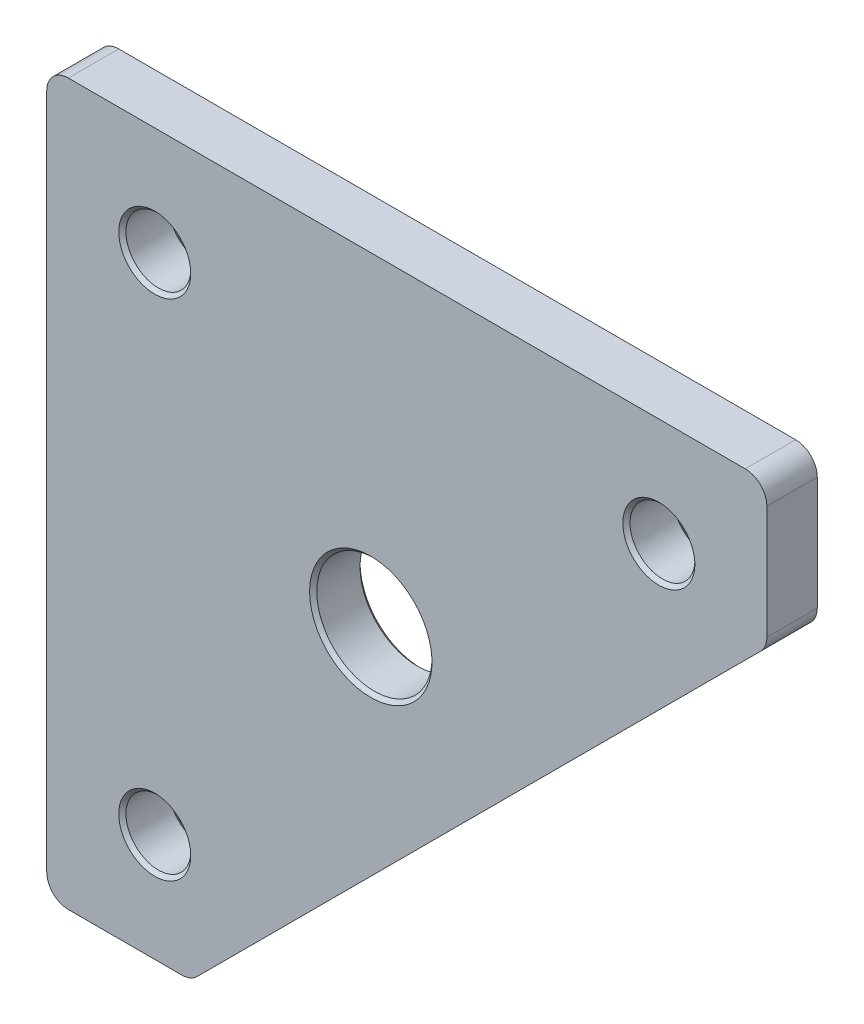
ISO-10303-21;
HEADER;
FILE_DESCRIPTION(('STEP AP214'),'2;1');
FILE_NAME('part.step','',(''),(''),'','','');
FILE_SCHEMA(('AUTOMOTIVE_DESIGN { 1 0 10303 214 1 1 1 1 }'));
ENDSEC;
DATA;
#1=APPLICATION_CONTEXT('core data for automotive mechanical design processes');
#2=APPLICATION_PROTOCOL_DEFINITION('international standard','automotive_design',2000,#1);
#3=PRODUCT_CONTEXT('',#1,'mechanical');
#4=PRODUCT('Part','Part','',(#3));
#5=PRODUCT_RELATED_PRODUCT_CATEGORY('part','',(#4));
#6=PRODUCT_DEFINITION_FORMATION('','',#4);
#7=PRODUCT_DEFINITION_CONTEXT('part definition',#1,'design');
#8=PRODUCT_DEFINITION('design','',#6,#7);
#9=PRODUCT_DEFINITION_SHAPE('','',#8);
#10=(LENGTH_UNIT() NAMED_UNIT(*) SI_UNIT(.MILLI.,.METRE.));
#11=(NAMED_UNIT(*) PLANE_ANGLE_UNIT() SI_UNIT($,.RADIAN.));
#12=(NAMED_UNIT(*) SI_UNIT($,.STERADIAN.) SOLID_ANGLE_UNIT());
#13=UNCERTAINTY_MEASURE_WITH_UNIT(LENGTH_MEASURE(1.E-05),#10,'distance_accuracy_value','');
#14=(GEOMETRIC_REPRESENTATION_CONTEXT(3) GLOBAL_UNCERTAINTY_ASSIGNED_CONTEXT((#13)) GLOBAL_UNIT_ASSIGNED_CONTEXT((#10,
#11,#12)) REPRESENTATION_CONTEXT('',''));
#15=CARTESIAN_POINT('',(0.,0.,0.));
#16=DIRECTION('',(0.,0.,1.));
#17=DIRECTION('',(1.,0.,0.));
#18=AXIS2_PLACEMENT_3D('',#15,#16,#17);
#19=CARTESIAN_POINT('',(0.,-100.,7.));
#20=DIRECTION('',(-1.,0.,0.));
#21=DIRECTION('',(0.,0.,1.));
#22=AXIS2_PLACEMENT_3D('',#19,#20,#21);
#23=PLANE('',#22);
#24=DIRECTION('',(0.,1.,0.));
#25=VECTOR('',#24,1.);
#26=CARTESIAN_POINT('',(0.,-100.,0.));
#27=LINE('',#26,#25);
#28=CARTESIAN_POINT('',(0.,-97.,0.));
#29=VERTEX_POINT('',#28);
#30=CARTESIAN_POINT('',(0.,-3.,0.));
#31=VERTEX_POINT('',#30);
#32=EDGE_CURVE('E194',#29,#31,#27,.T.);
#33=ORIENTED_EDGE('',*,*,#32,.F.);
#34=DIRECTION('',(0.,0.,-1.));
#35=VECTOR('',#34,1.);
#36=CARTESIAN_POINT('',(0.,-97.,7.));
#37=LINE('',#36,#35);
#38=CARTESIAN_POINT('',(0.,-97.,7.));
#39=VERTEX_POINT('',#38);
#40=EDGE_CURVE('E155',#29,#39,#37,.F.);
#41=ORIENTED_EDGE('',*,*,#40,.T.);
#42=DIRECTION('',(0.,1.,0.));
#43=VECTOR('',#42,1.);
#44=CARTESIAN_POINT('',(0.,-100.,7.));
#45=LINE('',#44,#43);
#46=CARTESIAN_POINT('',(0.,-3.,7.));
#47=VERTEX_POINT('',#46);
#48=EDGE_CURVE('E133',#39,#47,#45,.T.);
#49=ORIENTED_EDGE('',*,*,#48,.T.);
#50=DIRECTION('',(0.,0.,-1.));
#51=VECTOR('',#50,1.);
#52=CARTESIAN_POINT('',(0.,-3.,7.));
#53=LINE('',#52,#51);
#54=EDGE_CURVE('E152',#47,#31,#53,.T.);
#55=ORIENTED_EDGE('',*,*,#54,.T.);
#56=EDGE_LOOP('',(#33,#41,#49,#55));
#57=FACE_BOUND('',#56,.T.);
#58=ADVANCED_FACE('F33',(#57),#23,.T.);
#59=CARTESIAN_POINT('',(20.,-100.,7.));
#60=DIRECTION('',(0.,-1.,0.));
#61=DIRECTION('',(0.,0.,-1.));
#62=AXIS2_PLACEMENT_3D('',#59,#60,#61);
#63=PLANE('',#62);
#64=DIRECTION('',(-1.,0.,0.));
#65=VECTOR('',#64,1.);
#66=CARTESIAN_POINT('',(20.,-100.,7.));
#67=LINE('',#66,#65);
#68=CARTESIAN_POINT('',(18.7573593128807,-100.,7.));
#69=VERTEX_POINT('',#68);
#70=CARTESIAN_POINT('',(3.,-100.,7.));
#71=VERTEX_POINT('',#70);
#72=EDGE_CURVE('E205',#69,#71,#67,.T.);
#73=ORIENTED_EDGE('',*,*,#72,.T.);
#74=DIRECTION('',(0.,0.,-1.));
#75=VECTOR('',#74,1.);
#76=CARTESIAN_POINT('',(3.,-100.,7.));
#77=LINE('',#76,#75);
#78=CARTESIAN_POINT('',(3.,-100.,0.));
#79=VERTEX_POINT('',#78);
#80=EDGE_CURVE('E132',#71,#79,#77,.T.);
#81=ORIENTED_EDGE('',*,*,#80,.T.);
#82=DIRECTION('',(-1.,0.,0.));
#83=VECTOR('',#82,1.);
#84=CARTESIAN_POINT('',(20.,-100.,0.));
#85=LINE('',#84,#83);
#86=CARTESIAN_POINT('',(18.7573593128807,-100.,0.));
#87=VERTEX_POINT('',#86);
#88=EDGE_CURVE('E115',#87,#79,#85,.T.);
#89=ORIENTED_EDGE('',*,*,#88,.F.);
#90=DIRECTION('',(0.,0.,-1.));
#91=VECTOR('',#90,1.);
#92=CARTESIAN_POINT('',(18.7573593128807,-100.,7.));
#93=LINE('',#92,#91);
#94=EDGE_CURVE('E129',#87,#69,#93,.F.);
#95=ORIENTED_EDGE('',*,*,#94,.T.);
#96=EDGE_LOOP('',(#73,#81,#89,#95));
#97=FACE_BOUND('',#96,.T.);
#98=ADVANCED_FACE('F128',(#97),#63,.T.);
#99=CARTESIAN_POINT('',(100.,-20.,7.));
#100=DIRECTION('',(0.707106781186548,-0.707106781186548,0.));
#101=DIRECTION('',(0.707106781186547,0.707106781186548,0.));
#102=AXIS2_PLACEMENT_3D('',#99,#100,#101);
#103=PLANE('',#102);
#104=DIRECTION('',(-0.707106781186547,-0.707106781186548,0.));
#105=VECTOR('',#104,1.);
#106=CARTESIAN_POINT('',(100.,-20.,7.));
#107=LINE('',#106,#105);
#108=CARTESIAN_POINT('',(99.1213203435596,-20.8786796564403,7.));
#109=VERTEX_POINT('',#108);
#110=CARTESIAN_POINT('',(20.8786796564404,-99.1213203435596,7.));
#111=VERTEX_POINT('',#110);
#112=EDGE_CURVE('E186',#109,#111,#107,.T.);
#113=ORIENTED_EDGE('',*,*,#112,.T.);
#114=DIRECTION('',(0.,0.,-1.));
#115=VECTOR('',#114,1.);
#116=CARTESIAN_POINT('',(20.8786796564404,-99.1213203435596,7.));
#117=LINE('',#116,#115);
#118=CARTESIAN_POINT('',(20.8786796564404,-99.1213203435596,0.));
#119=VERTEX_POINT('',#118);
#120=EDGE_CURVE('E171',#111,#119,#117,.T.);
#121=ORIENTED_EDGE('',*,*,#120,.T.);
#122=DIRECTION('',(-0.707106781186547,-0.707106781186548,0.));
#123=VECTOR('',#122,1.);
#124=CARTESIAN_POINT('',(100.,-20.,0.));
#125=LINE('',#124,#123);
#126=CARTESIAN_POINT('',(99.1213203435596,-20.8786796564403,0.));
#127=VERTEX_POINT('',#126);
#128=EDGE_CURVE('E117',#127,#119,#125,.T.);
#129=ORIENTED_EDGE('',*,*,#128,.F.);
#130=DIRECTION('',(0.,0.,-1.));
#131=VECTOR('',#130,1.);
#132=CARTESIAN_POINT('',(99.1213203435596,-20.8786796564403,7.));
#133=LINE('',#132,#131);
#134=EDGE_CURVE('E169',#127,#109,#133,.F.);
#135=ORIENTED_EDGE('',*,*,#134,.T.);
#136=EDGE_LOOP('',(#113,#121,#129,#135));
#137=FACE_BOUND('',#136,.T.);
#138=ADVANCED_FACE('F271',(#137),#103,.T.);
#139=CARTESIAN_POINT('',(100.,0.,7.));
#140=DIRECTION('',(1.,0.,0.));
#141=DIRECTION('',(0.,0.,-1.));
#142=AXIS2_PLACEMENT_3D('',#139,#140,#141);
#143=PLANE('',#142);
#144=DIRECTION('',(0.,-1.,0.));
#145=VECTOR('',#144,1.);
#146=CARTESIAN_POINT('',(100.,0.,7.));
#147=LINE('',#146,#145);
#148=CARTESIAN_POINT('',(100.,-3.,7.));
#149=VERTEX_POINT('',#148);
#150=CARTESIAN_POINT('',(100.,-18.7573593128807,7.));
#151=VERTEX_POINT('',#150);
#152=EDGE_CURVE('E177',#149,#151,#147,.T.);
#153=ORIENTED_EDGE('',*,*,#152,.T.);
#154=DIRECTION('',(0.,0.,-1.));
#155=VECTOR('',#154,1.);
#156=CARTESIAN_POINT('',(100.,-18.7573593128807,7.));
#157=LINE('',#156,#155);
#158=CARTESIAN_POINT('',(100.,-18.7573593128807,0.));
#159=VERTEX_POINT('',#158);
#160=EDGE_CURVE('E11',#151,#159,#157,.T.);
#161=ORIENTED_EDGE('',*,*,#160,.T.);
#162=DIRECTION('',(0.,-1.,0.));
#163=VECTOR('',#162,1.);
#164=CARTESIAN_POINT('',(100.,0.,0.));
#165=LINE('',#164,#163);
#166=CARTESIAN_POINT('',(100.,-3.,0.));
#167=VERTEX_POINT('',#166);
#168=EDGE_CURVE('E180',#167,#159,#165,.T.);
#169=ORIENTED_EDGE('',*,*,#168,.F.);
#170=DIRECTION('',(0.,0.,-1.));
#171=VECTOR('',#170,1.);
#172=CARTESIAN_POINT('',(100.,-3.,7.));
#173=LINE('',#172,#171);
#174=EDGE_CURVE('E41',#167,#149,#173,.F.);
#175=ORIENTED_EDGE('',*,*,#174,.T.);
#176=EDGE_LOOP('',(#153,#161,#169,#175));
#177=FACE_BOUND('',#176,.T.);
#178=ADVANCED_FACE('F176',(#177),#143,.T.);
#179=CARTESIAN_POINT('',(0.,0.,7.));
#180=DIRECTION('',(0.,1.,0.));
#181=DIRECTION('',(0.,0.,1.));
#182=AXIS2_PLACEMENT_3D('',#179,#180,#181);
#183=PLANE('',#182);
#184=DIRECTION('',(1.,0.,0.));
#185=VECTOR('',#184,1.);
#186=CARTESIAN_POINT('',(0.,0.,0.));
#187=LINE('',#186,#185);
#188=CARTESIAN_POINT('',(3.,0.,0.));
#189=VERTEX_POINT('',#188);
#190=CARTESIAN_POINT('',(97.,0.,0.));
#191=VERTEX_POINT('',#190);
#192=EDGE_CURVE('E192',#189,#191,#187,.T.);
#193=ORIENTED_EDGE('',*,*,#192,.F.);
#194=DIRECTION('',(0.,0.,-1.));
#195=VECTOR('',#194,1.);
#196=CARTESIAN_POINT('',(3.,0.,7.));
#197=LINE('',#196,#195);
#198=CARTESIAN_POINT('',(3.,0.,7.));
#199=VERTEX_POINT('',#198);
#200=EDGE_CURVE('E55',#189,#199,#197,.F.);
#201=ORIENTED_EDGE('',*,*,#200,.T.);
#202=DIRECTION('',(1.,0.,0.));
#203=VECTOR('',#202,1.);
#204=CARTESIAN_POINT('',(0.,0.,7.));
#205=LINE('',#204,#203);
#206=CARTESIAN_POINT('',(97.,0.,7.));
#207=VERTEX_POINT('',#206);
#208=EDGE_CURVE('E187',#199,#207,#205,.T.);
#209=ORIENTED_EDGE('',*,*,#208,.T.);
#210=DIRECTION('',(0.,0.,-1.));
#211=VECTOR('',#210,1.);
#212=CARTESIAN_POINT('',(97.,0.,7.));
#213=LINE('',#212,#211);
#214=EDGE_CURVE('E165',#207,#191,#213,.T.);
#215=ORIENTED_EDGE('',*,*,#214,.T.);
#216=EDGE_LOOP('',(#193,#201,#209,#215));
#217=FACE_BOUND('',#216,.T.);
#218=ADVANCED_FACE('F191',(#217),#183,.T.);
#219=CARTESIAN_POINT('',(0.,0.,7.));
#220=DIRECTION('',(0.,0.,-1.));
#221=DIRECTION('',(-1.,0.,0.));
#222=AXIS2_PLACEMENT_3D('',#219,#220,#221);
#223=PLANE('',#222);
#224=CARTESIAN_POINT('',(15.,-85.,7.));
#225=DIRECTION('',(0.,0.,-1.));
#226=DIRECTION('',(-1.,0.,0.));
#227=AXIS2_PLACEMENT_3D('',#224,#225,#226);
#228=CIRCLE('',#227,5.00000000004485);
#229=CARTESIAN_POINT('',(9.99999999995517,-85.,7.));
#230=VERTEX_POINT('',#229);
#231=EDGE_CURVE('E229',#230,#230,#228,.T.);
#232=ORIENTED_EDGE('',*,*,#231,.T.);
#233=EDGE_LOOP('',(#232));
#234=FACE_BOUND('',#233,.T.);
#235=CARTESIAN_POINT('',(15.,-15.,7.));
#236=DIRECTION('',(0.,0.,-1.));
#237=DIRECTION('',(-1.,0.,0.));
#238=AXIS2_PLACEMENT_3D('',#235,#236,#237);
#239=CIRCLE('',#238,5.00000000004483);
#240=CARTESIAN_POINT('',(9.99999999995517,-15.,7.));
#241=VERTEX_POINT('',#240);
#242=EDGE_CURVE('E226',#241,#241,#239,.T.);
#243=ORIENTED_EDGE('',*,*,#242,.T.);
#244=EDGE_LOOP('',(#243));
#245=FACE_BOUND('',#244,.T.);
#246=CARTESIAN_POINT('',(45.,-45.,7.));
#247=DIRECTION('',(0.,0.,-1.));
#248=DIRECTION('',(-1.,0.,0.));
#249=AXIS2_PLACEMENT_3D('',#246,#247,#248);
#250=CIRCLE('',#249,8.50000000004486);
#251=CARTESIAN_POINT('',(36.4999999999551,-45.,7.));
#252=VERTEX_POINT('',#251);
#253=EDGE_CURVE('E223',#252,#252,#250,.T.);
#254=ORIENTED_EDGE('',*,*,#253,.T.);
#255=EDGE_LOOP('',(#254));
#256=FACE_BOUND('',#255,.T.);
#257=CARTESIAN_POINT('',(85.,-15.,7.));
#258=DIRECTION('',(0.,0.,-1.));
#259=DIRECTION('',(-1.,0.,0.));
#260=AXIS2_PLACEMENT_3D('',#257,#258,#259);
#261=CIRCLE('',#260,5.00000000004483);
#262=CARTESIAN_POINT('',(79.9999999999552,-15.,7.));
#263=VERTEX_POINT('',#262);
#264=EDGE_CURVE('E220',#263,#263,#261,.T.);
#265=ORIENTED_EDGE('',*,*,#264,.T.);
#266=EDGE_LOOP('',(#265));
#267=FACE_BOUND('',#266,.T.);
#268=ORIENTED_EDGE('',*,*,#48,.F.);
#269=CARTESIAN_POINT('',(3.,-97.,7.));
#270=DIRECTION('',(0.,0.,-1.));
#271=DIRECTION('',(-1.,0.,0.));
#272=AXIS2_PLACEMENT_3D('',#269,#270,#271);
#273=CIRCLE('',#272,3.);
#274=EDGE_CURVE('E163',#39,#71,#273,.F.);
#275=ORIENTED_EDGE('',*,*,#274,.T.);
#276=ORIENTED_EDGE('',*,*,#72,.F.);
#277=CARTESIAN_POINT('',(18.7573593128807,-97.,7.));
#278=DIRECTION('',(0.,0.,-1.));
#279=DIRECTION('',(-1.,0.,0.));
#280=AXIS2_PLACEMENT_3D('',#277,#278,#279);
#281=CIRCLE('',#280,3.);
#282=EDGE_CURVE('E137',#69,#111,#281,.F.);
#283=ORIENTED_EDGE('',*,*,#282,.T.);
#284=ORIENTED_EDGE('',*,*,#112,.F.);
#285=CARTESIAN_POINT('',(97.,-18.7573593128807,7.));
#286=DIRECTION('',(0.,0.,-1.));
#287=DIRECTION('',(-1.,0.,0.));
#288=AXIS2_PLACEMENT_3D('',#285,#286,#287);
#289=CIRCLE('',#288,3.);
#290=EDGE_CURVE('E158',#109,#151,#289,.F.);
#291=ORIENTED_EDGE('',*,*,#290,.T.);
#292=ORIENTED_EDGE('',*,*,#152,.F.);
#293=CARTESIAN_POINT('',(97.,-3.,7.));
#294=DIRECTION('',(0.,0.,-1.));
#295=DIRECTION('',(-1.,0.,0.));
#296=AXIS2_PLACEMENT_3D('',#293,#294,#295);
#297=CIRCLE('',#296,3.);
#298=EDGE_CURVE('E48',#149,#207,#297,.F.);
#299=ORIENTED_EDGE('',*,*,#298,.T.);
#300=ORIENTED_EDGE('',*,*,#208,.F.);
#301=CARTESIAN_POINT('',(3.,-3.,7.));
#302=DIRECTION('',(0.,0.,-1.));
#303=DIRECTION('',(-1.,0.,0.));
#304=AXIS2_PLACEMENT_3D('',#301,#302,#303);
#305=CIRCLE('',#304,3.);
#306=EDGE_CURVE('E161',#199,#47,#305,.F.);
#307=ORIENTED_EDGE('',*,*,#306,.T.);
#308=EDGE_LOOP('',(#268,#275,#276,#283,#284,#291,#292,#299,#300,#307));
#309=FACE_BOUND('',#308,.T.);
#310=ADVANCED_FACE('F183',(#234,#245,#256,#267,#309),#223,.F.);
#311=CARTESIAN_POINT('',(0.,0.,0.));
#312=DIRECTION('',(0.,0.,-1.));
#313=DIRECTION('',(-1.,0.,0.));
#314=AXIS2_PLACEMENT_3D('',#311,#312,#313);
#315=PLANE('',#314);
#316=CARTESIAN_POINT('',(85.,-15.,0.));
#317=DIRECTION('',(0.,0.,-1.));
#318=DIRECTION('',(-1.,0.,0.));
#319=AXIS2_PLACEMENT_3D('',#316,#317,#318);
#320=CIRCLE('',#319,5.00000000004486);
#321=CARTESIAN_POINT('',(79.9999999999552,-15.,0.));
#322=VERTEX_POINT('',#321);
#323=EDGE_CURVE('E211',#322,#322,#320,.F.);
#324=ORIENTED_EDGE('',*,*,#323,.T.);
#325=EDGE_LOOP('',(#324));
#326=FACE_BOUND('',#325,.T.);
#327=CARTESIAN_POINT('',(45.,-45.,0.));
#328=DIRECTION('',(0.,0.,-1.));
#329=DIRECTION('',(-1.,0.,0.));
#330=AXIS2_PLACEMENT_3D('',#327,#328,#329);
#331=CIRCLE('',#330,8.50000000004483);
#332=CARTESIAN_POINT('',(36.4999999999552,-45.,0.));
#333=VERTEX_POINT('',#332);
#334=EDGE_CURVE('E208',#333,#333,#331,.F.);
#335=ORIENTED_EDGE('',*,*,#334,.T.);
#336=EDGE_LOOP('',(#335));
#337=FACE_BOUND('',#336,.T.);
#338=CARTESIAN_POINT('',(15.,-85.,0.));
#339=DIRECTION('',(0.,0.,-1.));
#340=DIRECTION('',(-1.,0.,0.));
#341=AXIS2_PLACEMENT_3D('',#338,#339,#340);
#342=CIRCLE('',#341,5.00000000004483);
#343=CARTESIAN_POINT('',(9.99999999995518,-85.,0.));
#344=VERTEX_POINT('',#343);
#345=EDGE_CURVE('E204',#344,#344,#342,.F.);
#346=ORIENTED_EDGE('',*,*,#345,.T.);
#347=EDGE_LOOP('',(#346));
#348=FACE_BOUND('',#347,.T.);
#349=CARTESIAN_POINT('',(15.,-15.,0.));
#350=DIRECTION('',(0.,0.,-1.));
#351=DIRECTION('',(-1.,0.,0.));
#352=AXIS2_PLACEMENT_3D('',#349,#350,#351);
#353=CIRCLE('',#352,5.00000000004484);
#354=CARTESIAN_POINT('',(9.99999999995516,-15.,0.));
#355=VERTEX_POINT('',#354);
#356=EDGE_CURVE('E201',#355,#355,#353,.F.);
#357=ORIENTED_EDGE('',*,*,#356,.T.);
#358=EDGE_LOOP('',(#357));
#359=FACE_BOUND('',#358,.T.);
#360=ORIENTED_EDGE('',*,*,#88,.T.);
#361=CARTESIAN_POINT('',(3.,-97.,0.));
#362=DIRECTION('',(0.,0.,-1.));
#363=DIRECTION('',(-1.,0.,0.));
#364=AXIS2_PLACEMENT_3D('',#361,#362,#363);
#365=CIRCLE('',#364,3.);
#366=EDGE_CURVE('E150',#79,#29,#365,.T.);
#367=ORIENTED_EDGE('',*,*,#366,.T.);
#368=ORIENTED_EDGE('',*,*,#32,.T.);
#369=CARTESIAN_POINT('',(3.,-3.,0.));
#370=DIRECTION('',(0.,0.,-1.));
#371=DIRECTION('',(-1.,0.,0.));
#372=AXIS2_PLACEMENT_3D('',#369,#370,#371);
#373=CIRCLE('',#372,3.);
#374=EDGE_CURVE('E122',#31,#189,#373,.T.);
#375=ORIENTED_EDGE('',*,*,#374,.T.);
#376=ORIENTED_EDGE('',*,*,#192,.T.);
#377=CARTESIAN_POINT('',(97.,-3.,0.));
#378=DIRECTION('',(0.,0.,-1.));
#379=DIRECTION('',(-1.,0.,0.));
#380=AXIS2_PLACEMENT_3D('',#377,#378,#379);
#381=CIRCLE('',#380,3.);
#382=EDGE_CURVE('E140',#191,#167,#381,.T.);
#383=ORIENTED_EDGE('',*,*,#382,.T.);
#384=ORIENTED_EDGE('',*,*,#168,.T.);
#385=CARTESIAN_POINT('',(97.,-18.7573593128807,0.));
#386=DIRECTION('',(0.,0.,-1.));
#387=DIRECTION('',(-1.,0.,0.));
#388=AXIS2_PLACEMENT_3D('',#385,#386,#387);
#389=CIRCLE('',#388,3.);
#390=EDGE_CURVE('E123',#159,#127,#389,.T.);
#391=ORIENTED_EDGE('',*,*,#390,.T.);
#392=ORIENTED_EDGE('',*,*,#128,.T.);
#393=CARTESIAN_POINT('',(18.7573593128807,-97.,0.));
#394=DIRECTION('',(0.,0.,-1.));
#395=DIRECTION('',(-1.,0.,0.));
#396=AXIS2_PLACEMENT_3D('',#393,#394,#395);
#397=CIRCLE('',#396,3.);
#398=EDGE_CURVE('E112',#119,#87,#397,.T.);
#399=ORIENTED_EDGE('',*,*,#398,.T.);
#400=EDGE_LOOP('',(#360,#367,#368,#375,#376,#383,#384,#391,#392,#399));
#401=FACE_BOUND('',#400,.T.);
#402=ADVANCED_FACE('F114',(#326,#337,#348,#359,#401),#315,.T.);
#403=CARTESIAN_POINT('',(15.,-15.,7.));
#404=DIRECTION('',(0.,0.,1.));
#405=DIRECTION('',(1.,0.,0.));
#406=AXIS2_PLACEMENT_3D('',#403,#404,#405);
#407=CYLINDRICAL_SURFACE('',#406,4.49999999999999);
#408=CARTESIAN_POINT('',(15.,-15.,0.500000000044861));
#409=DIRECTION('',(0.,0.,-1.));
#410=DIRECTION('',(-1.,0.,0.));
#411=AXIS2_PLACEMENT_3D('',#408,#409,#410);
#412=CIRCLE('',#411,4.49999999999999);
#413=CARTESIAN_POINT('',(10.5,-15.,0.500000000044861));
#414=VERTEX_POINT('',#413);
#415=EDGE_CURVE('E138',#414,#414,#412,.T.);
#416=ORIENTED_EDGE('',*,*,#415,.T.);
#417=EDGE_LOOP('',(#416));
#418=FACE_BOUND('',#417,.T.);
#419=CARTESIAN_POINT('',(15.,-15.,6.49999999995517));
#420=DIRECTION('',(0.,0.,-1.));
#421=DIRECTION('',(-1.,0.,0.));
#422=AXIS2_PLACEMENT_3D('',#419,#420,#421);
#423=CIRCLE('',#422,4.49999999999999);
#424=CARTESIAN_POINT('',(10.5,-15.,6.49999999995517));
#425=VERTEX_POINT('',#424);
#426=EDGE_CURVE('E143',#425,#425,#423,.F.);
#427=ORIENTED_EDGE('',*,*,#426,.T.);
#428=EDGE_LOOP('',(#427));
#429=FACE_BOUND('',#428,.T.);
#430=ADVANCED_FACE('F246',(#418,#429),#407,.F.);
#431=CARTESIAN_POINT('',(85.,-15.,7.));
#432=DIRECTION('',(0.,0.,1.));
#433=DIRECTION('',(1.,0.,0.));
#434=AXIS2_PLACEMENT_3D('',#431,#432,#433);
#435=CYLINDRICAL_SURFACE('',#434,4.49999999999999);
#436=CARTESIAN_POINT('',(85.,-15.,0.500000000044866));
#437=DIRECTION('',(0.,0.,-1.));
#438=DIRECTION('',(-1.,0.,0.));
#439=AXIS2_PLACEMENT_3D('',#436,#437,#438);
#440=CIRCLE('',#439,4.49999999999999);
#441=CARTESIAN_POINT('',(80.5,-15.,0.500000000044866));
#442=VERTEX_POINT('',#441);
#443=EDGE_CURVE('E217',#442,#442,#440,.T.);
#444=ORIENTED_EDGE('',*,*,#443,.T.);
#445=EDGE_LOOP('',(#444));
#446=FACE_BOUND('',#445,.T.);
#447=CARTESIAN_POINT('',(85.,-15.,6.49999999995517));
#448=DIRECTION('',(0.,0.,-1.));
#449=DIRECTION('',(-1.,0.,0.));
#450=AXIS2_PLACEMENT_3D('',#447,#448,#449);
#451=CIRCLE('',#450,4.49999999999999);
#452=CARTESIAN_POINT('',(80.5,-15.,6.49999999995517));
#453=VERTEX_POINT('',#452);
#454=EDGE_CURVE('E214',#453,#453,#451,.F.);
#455=ORIENTED_EDGE('',*,*,#454,.T.);
#456=EDGE_LOOP('',(#455));
#457=FACE_BOUND('',#456,.T.);
#458=ADVANCED_FACE('F305',(#446,#457),#435,.F.);
#459=CARTESIAN_POINT('',(45.,-45.,7.));
#460=DIRECTION('',(0.,0.,1.));
#461=DIRECTION('',(1.,0.,0.));
#462=AXIS2_PLACEMENT_3D('',#459,#460,#461);
#463=CYLINDRICAL_SURFACE('',#462,7.99999999999999);
#464=CARTESIAN_POINT('',(45.,-45.,0.500000000044838));
#465=DIRECTION('',(0.,0.,-1.));
#466=DIRECTION('',(-1.,0.,0.));
#467=AXIS2_PLACEMENT_3D('',#464,#465,#466);
#468=CIRCLE('',#467,7.99999999999999);
#469=CARTESIAN_POINT('',(37.,-45.,0.500000000044838));
#470=VERTEX_POINT('',#469);
#471=EDGE_CURVE('E241',#470,#470,#468,.T.);
#472=ORIENTED_EDGE('',*,*,#471,.T.);
#473=EDGE_LOOP('',(#472));
#474=FACE_BOUND('',#473,.T.);
#475=CARTESIAN_POINT('',(45.,-45.,6.49999999995513));
#476=DIRECTION('',(0.,0.,-1.));
#477=DIRECTION('',(-1.,0.,0.));
#478=AXIS2_PLACEMENT_3D('',#475,#476,#477);
#479=CIRCLE('',#478,7.99999999999999);
#480=CARTESIAN_POINT('',(37.,-45.,6.49999999995513));
#481=VERTEX_POINT('',#480);
#482=EDGE_CURVE('E238',#481,#481,#479,.F.);
#483=ORIENTED_EDGE('',*,*,#482,.T.);
#484=EDGE_LOOP('',(#483));
#485=FACE_BOUND('',#484,.T.);
#486=ADVANCED_FACE('F299',(#474,#485),#463,.F.);
#487=CARTESIAN_POINT('',(15.,-85.,0.));
#488=DIRECTION('',(0.,0.,-1.));
#489=DIRECTION('',(-1.,0.,0.));
#490=AXIS2_PLACEMENT_3D('',#487,#488,#489);
#491=CYLINDRICAL_SURFACE('',#490,4.5);
#492=CARTESIAN_POINT('',(15.,-85.,6.49999999995515));
#493=DIRECTION('',(0.,0.,-1.));
#494=DIRECTION('',(-1.,0.,0.));
#495=AXIS2_PLACEMENT_3D('',#492,#493,#494);
#496=CIRCLE('',#495,4.5);
#497=CARTESIAN_POINT('',(10.5,-85.,6.49999999995515));
#498=VERTEX_POINT('',#497);
#499=EDGE_CURVE('E235',#498,#498,#496,.F.);
#500=ORIENTED_EDGE('',*,*,#499,.T.);
#501=EDGE_LOOP('',(#500));
#502=FACE_BOUND('',#501,.T.);
#503=CARTESIAN_POINT('',(15.,-85.,0.500000000044823));
#504=DIRECTION('',(0.,0.,-1.));
#505=DIRECTION('',(-1.,0.,0.));
#506=AXIS2_PLACEMENT_3D('',#503,#504,#505);
#507=CIRCLE('',#506,4.5);
#508=CARTESIAN_POINT('',(10.5,-85.,0.500000000044823));
#509=VERTEX_POINT('',#508);
#510=EDGE_CURVE('E232',#509,#509,#507,.T.);
#511=ORIENTED_EDGE('',*,*,#510,.T.);
#512=EDGE_LOOP('',(#511));
#513=FACE_BOUND('',#512,.T.);
#514=ADVANCED_FACE('F281',(#502,#513),#491,.F.);
#515=CARTESIAN_POINT('',(85.,-15.,0.));
#516=DIRECTION('',(0.,0.,-1.));
#517=DIRECTION('',(-1.,0.,0.));
#518=AXIS2_PLACEMENT_3D('',#515,#516,#517);
#519=CONICAL_SURFACE('',#518,5.00000000004486,0.785398163397449);
#520=ORIENTED_EDGE('',*,*,#443,.F.);
#521=EDGE_LOOP('',(#520));
#522=FACE_BOUND('',#521,.T.);
#523=ORIENTED_EDGE('',*,*,#323,.F.);
#524=EDGE_LOOP('',(#523));
#525=FACE_BOUND('',#524,.T.);
#526=ADVANCED_FACE('F277',(#522,#525),#519,.F.);
#527=CARTESIAN_POINT('',(15.,-85.,7.));
#528=DIRECTION('',(0.,0.,1.));
#529=DIRECTION('',(1.,0.,0.));
#530=AXIS2_PLACEMENT_3D('',#527,#528,#529);
#531=CONICAL_SURFACE('',#530,5.00000000004485,0.785398163397444);
#532=ORIENTED_EDGE('',*,*,#499,.F.);
#533=EDGE_LOOP('',(#532));
#534=FACE_BOUND('',#533,.T.);
#535=ORIENTED_EDGE('',*,*,#231,.F.);
#536=EDGE_LOOP('',(#535));
#537=FACE_BOUND('',#536,.T.);
#538=ADVANCED_FACE('F280',(#534,#537),#531,.F.);
#539=CARTESIAN_POINT('',(45.,-45.,0.));
#540=DIRECTION('',(0.,0.,-1.));
#541=DIRECTION('',(-1.,0.,0.));
#542=AXIS2_PLACEMENT_3D('',#539,#540,#541);
#543=CONICAL_SURFACE('',#542,8.50000000004483,0.78539816339745);
#544=ORIENTED_EDGE('',*,*,#471,.F.);
#545=EDGE_LOOP('',(#544));
#546=FACE_BOUND('',#545,.T.);
#547=ORIENTED_EDGE('',*,*,#334,.F.);
#548=EDGE_LOOP('',(#547));
#549=FACE_BOUND('',#548,.T.);
#550=ADVANCED_FACE('F285',(#546,#549),#543,.F.);
#551=CARTESIAN_POINT('',(15.,-85.,0.500000000044823));
#552=DIRECTION('',(0.,0.,-1.));
#553=DIRECTION('',(-1.,0.,0.));
#554=AXIS2_PLACEMENT_3D('',#551,#552,#553);
#555=CONICAL_SURFACE('',#554,4.5,0.785398163397459);
#556=ORIENTED_EDGE('',*,*,#345,.F.);
#557=EDGE_LOOP('',(#556));
#558=FACE_BOUND('',#557,.T.);
#559=ORIENTED_EDGE('',*,*,#510,.F.);
#560=EDGE_LOOP('',(#559));
#561=FACE_BOUND('',#560,.T.);
#562=ADVANCED_FACE('F261',(#558,#561),#555,.F.);
#563=CARTESIAN_POINT('',(15.,-15.,0.));
#564=DIRECTION('',(0.,0.,-1.));
#565=DIRECTION('',(-1.,0.,0.));
#566=AXIS2_PLACEMENT_3D('',#563,#564,#565);
#567=CONICAL_SURFACE('',#566,5.00000000004484,0.785398163397439);
#568=ORIENTED_EDGE('',*,*,#415,.F.);
#569=EDGE_LOOP('',(#568));
#570=FACE_BOUND('',#569,.T.);
#571=ORIENTED_EDGE('',*,*,#356,.F.);
#572=EDGE_LOOP('',(#571));
#573=FACE_BOUND('',#572,.T.);
#574=ADVANCED_FACE('F251',(#570,#573),#567,.F.);
#575=CARTESIAN_POINT('',(15.,-15.,6.49999999995517));
#576=DIRECTION('',(0.,0.,1.));
#577=DIRECTION('',(1.,0.,0.));
#578=AXIS2_PLACEMENT_3D('',#575,#576,#577);
#579=CONICAL_SURFACE('',#578,4.49999999999999,0.785398163397458);
#580=ORIENTED_EDGE('',*,*,#242,.F.);
#581=EDGE_LOOP('',(#580));
#582=FACE_BOUND('',#581,.T.);
#583=ORIENTED_EDGE('',*,*,#426,.F.);
#584=EDGE_LOOP('',(#583));
#585=FACE_BOUND('',#584,.T.);
#586=ADVANCED_FACE('F248',(#582,#585),#579,.F.);
#587=CARTESIAN_POINT('',(45.,-45.,6.49999999995513));
#588=DIRECTION('',(0.,0.,1.));
#589=DIRECTION('',(1.,0.,0.));
#590=AXIS2_PLACEMENT_3D('',#587,#588,#589);
#591=CONICAL_SURFACE('',#590,7.99999999999999,0.785398163397448);
#592=ORIENTED_EDGE('',*,*,#253,.F.);
#593=EDGE_LOOP('',(#592));
#594=FACE_BOUND('',#593,.T.);
#595=ORIENTED_EDGE('',*,*,#482,.F.);
#596=EDGE_LOOP('',(#595));
#597=FACE_BOUND('',#596,.T.);
#598=ADVANCED_FACE('F250',(#594,#597),#591,.F.);
#599=CARTESIAN_POINT('',(85.,-15.,6.49999999995517));
#600=DIRECTION('',(0.,0.,1.));
#601=DIRECTION('',(1.,0.,0.));
#602=AXIS2_PLACEMENT_3D('',#599,#600,#601);
#603=CONICAL_SURFACE('',#602,4.49999999999999,0.785398163397458);
#604=ORIENTED_EDGE('',*,*,#264,.F.);
#605=EDGE_LOOP('',(#604));
#606=FACE_BOUND('',#605,.T.);
#607=ORIENTED_EDGE('',*,*,#454,.F.);
#608=EDGE_LOOP('',(#607));
#609=FACE_BOUND('',#608,.T.);
#610=ADVANCED_FACE('F258',(#606,#609),#603,.F.);
#611=CARTESIAN_POINT('',(3.,-97.,7.));
#612=DIRECTION('',(0.,0.,-1.));
#613=DIRECTION('',(-1.,0.,0.));
#614=AXIS2_PLACEMENT_3D('',#611,#612,#613);
#615=CYLINDRICAL_SURFACE('',#614,3.);
#616=ORIENTED_EDGE('',*,*,#274,.F.);
#617=ORIENTED_EDGE('',*,*,#40,.F.);
#618=ORIENTED_EDGE('',*,*,#366,.F.);
#619=ORIENTED_EDGE('',*,*,#80,.F.);
#620=EDGE_LOOP('',(#616,#617,#618,#619));
#621=FACE_BOUND('',#620,.T.);
#622=ADVANCED_FACE('F400',(#621),#615,.T.);
#623=CARTESIAN_POINT('',(3.,-3.,7.));
#624=DIRECTION('',(0.,0.,-1.));
#625=DIRECTION('',(-1.,0.,0.));
#626=AXIS2_PLACEMENT_3D('',#623,#624,#625);
#627=CYLINDRICAL_SURFACE('',#626,3.);
#628=ORIENTED_EDGE('',*,*,#306,.F.);
#629=ORIENTED_EDGE('',*,*,#200,.F.);
#630=ORIENTED_EDGE('',*,*,#374,.F.);
#631=ORIENTED_EDGE('',*,*,#54,.F.);
#632=EDGE_LOOP('',(#628,#629,#630,#631));
#633=FACE_BOUND('',#632,.T.);
#634=ADVANCED_FACE('F440',(#633),#627,.T.);
#635=CARTESIAN_POINT('',(18.7573593128807,-97.,7.));
#636=DIRECTION('',(0.,0.,-1.));
#637=DIRECTION('',(-1.,0.,0.));
#638=AXIS2_PLACEMENT_3D('',#635,#636,#637);
#639=CYLINDRICAL_SURFACE('',#638,3.);
#640=ORIENTED_EDGE('',*,*,#282,.F.);
#641=ORIENTED_EDGE('',*,*,#94,.F.);
#642=ORIENTED_EDGE('',*,*,#398,.F.);
#643=ORIENTED_EDGE('',*,*,#120,.F.);
#644=EDGE_LOOP('',(#640,#641,#642,#643));
#645=FACE_BOUND('',#644,.T.);
#646=ADVANCED_FACE('F136',(#645),#639,.T.);
#647=CARTESIAN_POINT('',(97.,-18.7573593128807,7.));
#648=DIRECTION('',(0.,0.,-1.));
#649=DIRECTION('',(-1.,0.,0.));
#650=AXIS2_PLACEMENT_3D('',#647,#648,#649);
#651=CYLINDRICAL_SURFACE('',#650,3.);
#652=ORIENTED_EDGE('',*,*,#290,.F.);
#653=ORIENTED_EDGE('',*,*,#134,.F.);
#654=ORIENTED_EDGE('',*,*,#390,.F.);
#655=ORIENTED_EDGE('',*,*,#160,.F.);
#656=EDGE_LOOP('',(#652,#653,#654,#655));
#657=FACE_BOUND('',#656,.T.);
#658=ADVANCED_FACE('F454',(#657),#651,.T.);
#659=CARTESIAN_POINT('',(97.,-3.,7.));
#660=DIRECTION('',(0.,0.,-1.));
#661=DIRECTION('',(-1.,0.,0.));
#662=AXIS2_PLACEMENT_3D('',#659,#660,#661);
#663=CYLINDRICAL_SURFACE('',#662,3.);
#664=ORIENTED_EDGE('',*,*,#298,.F.);
#665=ORIENTED_EDGE('',*,*,#174,.F.);
#666=ORIENTED_EDGE('',*,*,#382,.F.);
#667=ORIENTED_EDGE('',*,*,#214,.F.);
#668=EDGE_LOOP('',(#664,#665,#666,#667));
#669=FACE_BOUND('',#668,.T.);
#670=ADVANCED_FACE('F35',(#669),#663,.T.);
#671=CLOSED_SHELL('',(#58,#98,#138,#178,#218,#310,#402,#430,#458,#486,#514,#526,#538,#550,#562,
#574,#586,#598,#610,#622,#634,#646,#658,#670));
#672=MANIFOLD_SOLID_BREP('B2',#671);
#673=ADVANCED_BREP_SHAPE_REPRESENTATION('',(#18,#672),#14);
#674=SHAPE_DEFINITION_REPRESENTATION(#9,#673);
ENDSEC;
END-ISO-10303-21;
